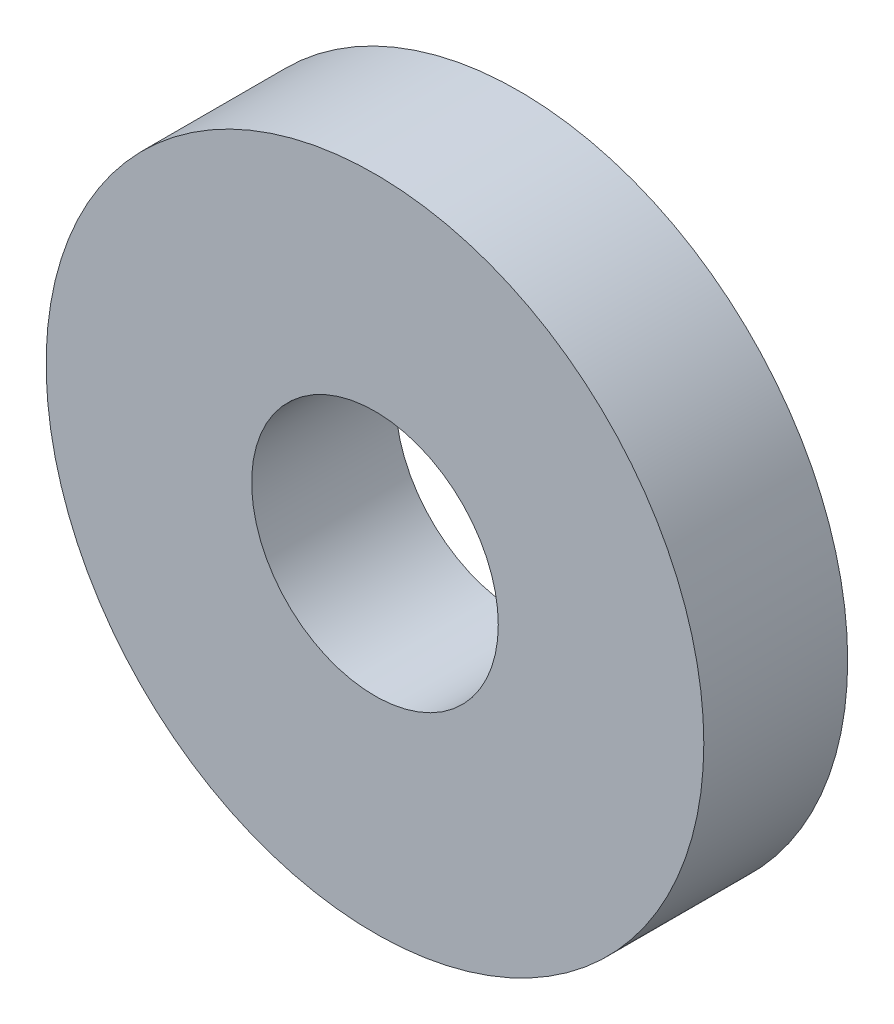
ISO-10303-21;
HEADER;
FILE_DESCRIPTION(('STEP AP214'),'2;1');
FILE_NAME('part.step','',(''),(''),'','','');
FILE_SCHEMA(('AUTOMOTIVE_DESIGN { 1 0 10303 214 1 1 1 1 }'));
ENDSEC;
DATA;
#1=APPLICATION_CONTEXT('core data for automotive mechanical design processes');
#2=APPLICATION_PROTOCOL_DEFINITION('international standard','automotive_design',2000,#1);
#3=PRODUCT_CONTEXT('',#1,'mechanical');
#4=PRODUCT('Part','Part','',(#3));
#5=PRODUCT_RELATED_PRODUCT_CATEGORY('part','',(#4));
#6=PRODUCT_DEFINITION_FORMATION('','',#4);
#7=PRODUCT_DEFINITION_CONTEXT('part definition',#1,'design');
#8=PRODUCT_DEFINITION('design','',#6,#7);
#9=PRODUCT_DEFINITION_SHAPE('','',#8);
#10=(LENGTH_UNIT() NAMED_UNIT(*) SI_UNIT(.MILLI.,.METRE.));
#11=(NAMED_UNIT(*) PLANE_ANGLE_UNIT() SI_UNIT($,.RADIAN.));
#12=(NAMED_UNIT(*) SI_UNIT($,.STERADIAN.) SOLID_ANGLE_UNIT());
#13=UNCERTAINTY_MEASURE_WITH_UNIT(LENGTH_MEASURE(1.E-05),#10,'distance_accuracy_value','');
#14=(GEOMETRIC_REPRESENTATION_CONTEXT(3) GLOBAL_UNCERTAINTY_ASSIGNED_CONTEXT((#13)) GLOBAL_UNIT_ASSIGNED_CONTEXT((#10,
#11,#12)) REPRESENTATION_CONTEXT('',''));
#15=CARTESIAN_POINT('',(0.,0.,0.));
#16=DIRECTION('',(0.,0.,1.));
#17=DIRECTION('',(1.,0.,0.));
#18=AXIS2_PLACEMENT_3D('',#15,#16,#17);
#19=CARTESIAN_POINT('',(0.,0.,150.));
#20=DIRECTION('',(0.,0.,1.));
#21=DIRECTION('',(1.,0.,0.));
#22=AXIS2_PLACEMENT_3D('',#19,#20,#21);
#23=CYLINDRICAL_SURFACE('',#22,6.);
#24=CARTESIAN_POINT('',(0.,0.,54.));
#25=DIRECTION('',(0.,0.,1.));
#26=DIRECTION('',(1.,0.,0.));
#27=AXIS2_PLACEMENT_3D('',#24,#25,#26);
#28=CIRCLE('',#27,6.);
#29=CARTESIAN_POINT('',(6.,0.,54.));
#30=VERTEX_POINT('',#29);
#31=EDGE_CURVE('E59',#30,#30,#28,.T.);
#32=ORIENTED_EDGE('',*,*,#31,.T.);
#33=EDGE_LOOP('',(#32));
#34=FACE_BOUND('',#33,.T.);
#35=CARTESIAN_POINT('',(0.,0.,47.));
#36=DIRECTION('',(0.,0.,1.));
#37=DIRECTION('',(1.,0.,0.));
#38=AXIS2_PLACEMENT_3D('',#35,#36,#37);
#39=CIRCLE('',#38,6.);
#40=CARTESIAN_POINT('',(6.,0.,47.));
#41=VERTEX_POINT('',#40);
#42=EDGE_CURVE('E10',#41,#41,#39,.T.);
#43=ORIENTED_EDGE('',*,*,#42,.F.);
#44=EDGE_LOOP('',(#43));
#45=FACE_BOUND('',#44,.T.);
#46=ADVANCED_FACE('F39',(#34,#45),#23,.F.);
#47=CARTESIAN_POINT('',(6.,0.,47.));
#48=DIRECTION('',(0.,0.,-1.));
#49=DIRECTION('',(-1.,0.,0.));
#50=AXIS2_PLACEMENT_3D('',#47,#48,#49);
#51=PLANE('',#50);
#52=ORIENTED_EDGE('',*,*,#42,.T.);
#53=EDGE_LOOP('',(#52));
#54=FACE_BOUND('',#53,.T.);
#55=CARTESIAN_POINT('',(0.,0.,47.));
#56=DIRECTION('',(0.,0.,1.));
#57=DIRECTION('',(1.,0.,0.));
#58=AXIS2_PLACEMENT_3D('',#55,#56,#57);
#59=CIRCLE('',#58,16.);
#60=CARTESIAN_POINT('',(16.,0.,47.));
#61=VERTEX_POINT('',#60);
#62=EDGE_CURVE('E46',#61,#61,#59,.T.);
#63=ORIENTED_EDGE('',*,*,#62,.F.);
#64=EDGE_LOOP('',(#63));
#65=FACE_BOUND('',#64,.T.);
#66=ADVANCED_FACE('F77',(#54,#65),#51,.T.);
#67=CARTESIAN_POINT('',(0.,0.,150.));
#68=DIRECTION('',(0.,0.,1.));
#69=DIRECTION('',(1.,0.,0.));
#70=AXIS2_PLACEMENT_3D('',#67,#68,#69);
#71=CYLINDRICAL_SURFACE('',#70,16.);
#72=ORIENTED_EDGE('',*,*,#62,.T.);
#73=EDGE_LOOP('',(#72));
#74=FACE_BOUND('',#73,.T.);
#75=CARTESIAN_POINT('',(0.,0.,54.));
#76=DIRECTION('',(0.,0.,1.));
#77=DIRECTION('',(1.,0.,0.));
#78=AXIS2_PLACEMENT_3D('',#75,#76,#77);
#79=CIRCLE('',#78,16.);
#80=CARTESIAN_POINT('',(16.,0.,54.));
#81=VERTEX_POINT('',#80);
#82=EDGE_CURVE('E55',#81,#81,#79,.T.);
#83=ORIENTED_EDGE('',*,*,#82,.F.);
#84=EDGE_LOOP('',(#83));
#85=FACE_BOUND('',#84,.T.);
#86=ADVANCED_FACE('F68',(#74,#85),#71,.T.);
#87=CARTESIAN_POINT('',(16.,0.,54.));
#88=DIRECTION('',(0.,0.,1.));
#89=DIRECTION('',(1.,0.,0.));
#90=AXIS2_PLACEMENT_3D('',#87,#88,#89);
#91=PLANE('',#90);
#92=ORIENTED_EDGE('',*,*,#82,.T.);
#93=EDGE_LOOP('',(#92));
#94=FACE_BOUND('',#93,.T.);
#95=ORIENTED_EDGE('',*,*,#31,.F.);
#96=EDGE_LOOP('',(#95));
#97=FACE_BOUND('',#96,.T.);
#98=ADVANCED_FACE('F70',(#94,#97),#91,.T.);
#99=CLOSED_SHELL('',(#46,#66,#86,#98));
#100=MANIFOLD_SOLID_BREP('B2',#99);
#101=ADVANCED_BREP_SHAPE_REPRESENTATION('',(#18,#100),#14);
#102=SHAPE_DEFINITION_REPRESENTATION(#9,#101);
ENDSEC;
END-ISO-10303-21;
